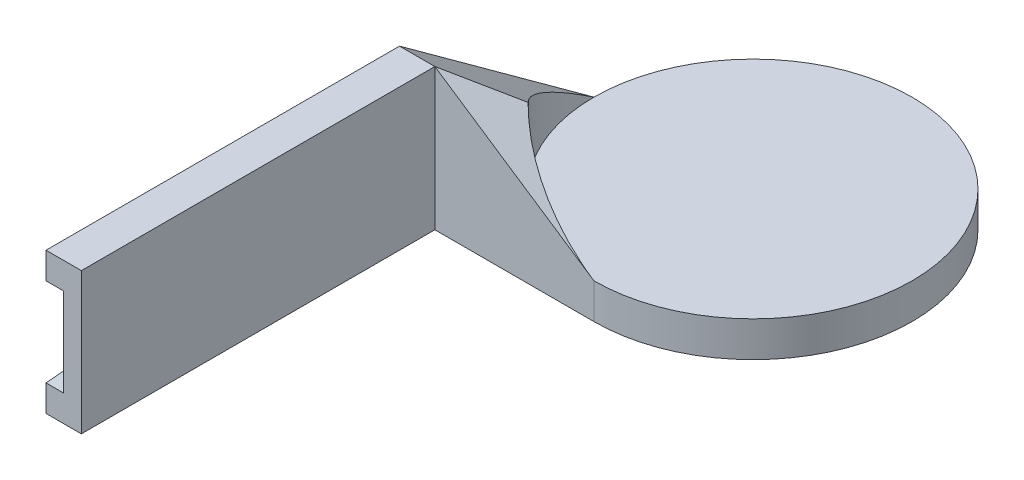
ISO-10303-21;
HEADER;
FILE_DESCRIPTION(('STEP AP214'),'2;1');
FILE_NAME('part.step','',(''),(''),'','','');
FILE_SCHEMA(('AUTOMOTIVE_DESIGN { 1 0 10303 214 1 1 1 1 }'));
ENDSEC;
DATA;
#1=APPLICATION_CONTEXT('core data for automotive mechanical design processes');
#2=APPLICATION_PROTOCOL_DEFINITION('international standard','automotive_design',2000,#1);
#3=PRODUCT_CONTEXT('',#1,'mechanical');
#4=PRODUCT('Part','Part','',(#3));
#5=PRODUCT_RELATED_PRODUCT_CATEGORY('part','',(#4));
#6=PRODUCT_DEFINITION_FORMATION('','',#4);
#7=PRODUCT_DEFINITION_CONTEXT('part definition',#1,'design');
#8=PRODUCT_DEFINITION('design','',#6,#7);
#9=PRODUCT_DEFINITION_SHAPE('','',#8);
#10=(LENGTH_UNIT() NAMED_UNIT(*) SI_UNIT(.MILLI.,.METRE.));
#11=(NAMED_UNIT(*) PLANE_ANGLE_UNIT() SI_UNIT($,.RADIAN.));
#12=(NAMED_UNIT(*) SI_UNIT($,.STERADIAN.) SOLID_ANGLE_UNIT());
#13=UNCERTAINTY_MEASURE_WITH_UNIT(LENGTH_MEASURE(1.E-05),#10,'distance_accuracy_value','');
#14=(GEOMETRIC_REPRESENTATION_CONTEXT(3) GLOBAL_UNCERTAINTY_ASSIGNED_CONTEXT((#13)) GLOBAL_UNIT_ASSIGNED_CONTEXT((#10,
#11,#12)) REPRESENTATION_CONTEXT('',''));
#15=CARTESIAN_POINT('',(0.,0.,0.));
#16=DIRECTION('',(0.,0.,1.));
#17=DIRECTION('',(1.,0.,0.));
#18=AXIS2_PLACEMENT_3D('',#15,#16,#17);
#19=CARTESIAN_POINT('',(22.,8.,29.));
#20=DIRECTION('',(0.,0.,-1.));
#21=DIRECTION('',(1.,0.,0.));
#22=AXIS2_PLACEMENT_3D('',#19,#20,#21);
#23=PLANE('',#22);
#24=DIRECTION('',(-1.,0.,0.));
#25=VECTOR('',#24,1.);
#26=CARTESIAN_POINT('',(12.,1.5,29.));
#27=LINE('',#26,#25);
#28=CARTESIAN_POINT('',(12.,1.5,29.));
#29=VERTEX_POINT('',#28);
#30=CARTESIAN_POINT('',(11.,1.5,29.));
#31=VERTEX_POINT('',#30);
#32=EDGE_CURVE('E232',#29,#31,#27,.T.);
#33=ORIENTED_EDGE('',*,*,#32,.T.);
#34=DIRECTION('',(0.,-1.,0.));
#35=VECTOR('',#34,1.);
#36=CARTESIAN_POINT('',(11.,8.,29.));
#37=LINE('',#36,#35);
#38=CARTESIAN_POINT('',(11.,0.,29.));
#39=VERTEX_POINT('',#38);
#40=EDGE_CURVE('E442',#31,#39,#37,.T.);
#41=ORIENTED_EDGE('',*,*,#40,.T.);
#42=DIRECTION('',(-1.,0.,0.));
#43=VECTOR('',#42,1.);
#44=CARTESIAN_POINT('',(22.,0.,29.));
#45=LINE('',#44,#43);
#46=CARTESIAN_POINT('',(13.,0.,29.));
#47=VERTEX_POINT('',#46);
#48=EDGE_CURVE('E430',#47,#39,#45,.T.);
#49=ORIENTED_EDGE('',*,*,#48,.F.);
#50=DIRECTION('',(0.,-1.,0.));
#51=VECTOR('',#50,1.);
#52=CARTESIAN_POINT('',(13.,8.,29.));
#53=LINE('',#52,#51);
#54=CARTESIAN_POINT('',(13.,8.,29.));
#55=VERTEX_POINT('',#54);
#56=EDGE_CURVE('E446',#55,#47,#53,.T.);
#57=ORIENTED_EDGE('',*,*,#56,.F.);
#58=DIRECTION('',(-1.,0.,0.));
#59=VECTOR('',#58,1.);
#60=CARTESIAN_POINT('',(22.,8.,29.));
#61=LINE('',#60,#59);
#62=CARTESIAN_POINT('',(11.,8.,29.));
#63=VERTEX_POINT('',#62);
#64=EDGE_CURVE('E418',#55,#63,#61,.T.);
#65=ORIENTED_EDGE('',*,*,#64,.T.);
#66=CARTESIAN_POINT('',(11.,6.5,29.));
#67=VERTEX_POINT('',#66);
#68=EDGE_CURVE('E443',#63,#67,#37,.T.);
#69=ORIENTED_EDGE('',*,*,#68,.T.);
#70=DIRECTION('',(-1.,0.,0.));
#71=VECTOR('',#70,1.);
#72=CARTESIAN_POINT('',(12.,6.5,29.));
#73=LINE('',#72,#71);
#74=CARTESIAN_POINT('',(12.,6.5,29.));
#75=VERTEX_POINT('',#74);
#76=EDGE_CURVE('E263',#75,#67,#73,.T.);
#77=ORIENTED_EDGE('',*,*,#76,.F.);
#78=DIRECTION('',(0.,-1.,0.));
#79=VECTOR('',#78,1.);
#80=CARTESIAN_POINT('',(12.,0.,29.));
#81=LINE('',#80,#79);
#82=EDGE_CURVE('E240',#75,#29,#81,.T.);
#83=ORIENTED_EDGE('',*,*,#82,.T.);
#84=EDGE_LOOP('',(#33,#41,#49,#57,#65,#69,#77,#83));
#85=FACE_BOUND('',#84,.T.);
#86=ADVANCED_FACE('F37',(#85),#23,.F.);
#87=CARTESIAN_POINT('',(11.,8.,0.));
#88=DIRECTION('',(1.,0.,0.));
#89=DIRECTION('',(0.,0.,1.));
#90=AXIS2_PLACEMENT_3D('',#87,#88,#89);
#91=PLANE('',#90);
#92=DIRECTION('',(0.,-0.0866296163648418,0.996240588195683));
#93=VECTOR('',#92,1.);
#94=CARTESIAN_POINT('',(11.,3.99155722326454,0.347091932457785));
#95=LINE('',#94,#93);
#96=CARTESIAN_POINT('',(11.,2.5,17.5));
#97=VERTEX_POINT('',#96);
#98=EDGE_CURVE('E250',#97,#31,#95,.T.);
#99=ORIENTED_EDGE('',*,*,#98,.F.);
#100=CARTESIAN_POINT('',(11.,4.,17.5));
#101=DIRECTION('',(1.,0.,0.));
#102=DIRECTION('',(0.,0.,-1.));
#103=AXIS2_PLACEMENT_3D('',#100,#101,#102);
#104=CIRCLE('',#103,1.5);
#105=CARTESIAN_POINT('',(11.,5.5,17.5));
#106=VERTEX_POINT('',#105);
#107=EDGE_CURVE('E224',#97,#106,#104,.T.);
#108=ORIENTED_EDGE('',*,*,#107,.T.);
#109=DIRECTION('',(0.,-0.0866296163648419,-0.996240588195683));
#110=VECTOR('',#109,1.);
#111=CARTESIAN_POINT('',(11.,3.94840525328331,-0.343339587242026));
#112=LINE('',#111,#110);
#113=EDGE_CURVE('E253',#67,#106,#112,.T.);
#114=ORIENTED_EDGE('',*,*,#113,.F.);
#115=ORIENTED_EDGE('',*,*,#68,.F.);
#116=DIRECTION('',(0.,0.,-1.));
#117=VECTOR('',#116,1.);
#118=CARTESIAN_POINT('',(11.,8.,0.));
#119=LINE('',#118,#117);
#120=CARTESIAN_POINT('',(11.,8.,9.));
#121=VERTEX_POINT('',#120);
#122=EDGE_CURVE('E422',#63,#121,#119,.T.);
#123=ORIENTED_EDGE('',*,*,#122,.T.);
#124=DIRECTION('',(0.,-1.,0.));
#125=VECTOR('',#124,1.);
#126=CARTESIAN_POINT('',(11.,8.,9.));
#127=LINE('',#126,#125);
#128=CARTESIAN_POINT('',(11.,0.,9.));
#129=VERTEX_POINT('',#128);
#130=EDGE_CURVE('E439',#121,#129,#127,.T.);
#131=ORIENTED_EDGE('',*,*,#130,.T.);
#132=DIRECTION('',(0.,0.,-1.));
#133=VECTOR('',#132,1.);
#134=CARTESIAN_POINT('',(11.,0.,0.));
#135=LINE('',#134,#133);
#136=EDGE_CURVE('E433',#39,#129,#135,.T.);
#137=ORIENTED_EDGE('',*,*,#136,.F.);
#138=ORIENTED_EDGE('',*,*,#40,.F.);
#139=EDGE_LOOP('',(#99,#108,#114,#115,#123,#131,#137,#138));
#140=FACE_BOUND('',#139,.T.);
#141=ADVANCED_FACE('F482',(#140),#91,.F.);
#142=CARTESIAN_POINT('',(22.,2.,0.));
#143=DIRECTION('',(0.,-1.,0.));
#144=DIRECTION('',(0.,0.,-1.));
#145=AXIS2_PLACEMENT_3D('',#142,#143,#144);
#146=CYLINDRICAL_SURFACE('',#145,9.);
#147=DIRECTION('',(0.,-1.,0.));
#148=VECTOR('',#147,1.);
#149=CARTESIAN_POINT('',(22.,8.,9.));
#150=LINE('',#149,#148);
#151=CARTESIAN_POINT('',(22.,2.,9.));
#152=VERTEX_POINT('',#151);
#153=CARTESIAN_POINT('',(22.,0.,9.));
#154=VERTEX_POINT('',#153);
#155=EDGE_CURVE('E451',#152,#154,#150,.T.);
#156=ORIENTED_EDGE('',*,*,#155,.T.);
#157=CARTESIAN_POINT('',(22.,0.,0.));
#158=DIRECTION('',(0.,-1.,0.));
#159=DIRECTION('',(0.,0.,1.));
#160=AXIS2_PLACEMENT_3D('',#157,#158,#159);
#161=CIRCLE('',#160,9.);
#162=CARTESIAN_POINT('',(13.,0.,0.));
#163=VERTEX_POINT('',#162);
#164=EDGE_CURVE('E454',#163,#154,#161,.T.);
#165=ORIENTED_EDGE('',*,*,#164,.F.);
#166=DIRECTION('',(0.,-1.,0.));
#167=VECTOR('',#166,1.);
#168=CARTESIAN_POINT('',(13.,8.,0.));
#169=LINE('',#168,#167);
#170=CARTESIAN_POINT('',(13.,2.,0.));
#171=VERTEX_POINT('',#170);
#172=EDGE_CURVE('E425',#171,#163,#169,.T.);
#173=ORIENTED_EDGE('',*,*,#172,.F.);
#174=CARTESIAN_POINT('',(22.,2.,0.));
#175=DIRECTION('',(0.,-1.,0.));
#176=DIRECTION('',(0.,0.,1.));
#177=AXIS2_PLACEMENT_3D('',#174,#175,#176);
#178=CIRCLE('',#177,9.);
#179=EDGE_CURVE('E456',#171,#152,#178,.T.);
#180=ORIENTED_EDGE('',*,*,#179,.T.);
#181=EDGE_LOOP('',(#156,#165,#173,#180));
#182=FACE_BOUND('',#181,.T.);
#183=ADVANCED_FACE('F39',(#182),#146,.T.);
#184=CARTESIAN_POINT('',(22.,2.,0.));
#185=DIRECTION('',(0.,1.,0.));
#186=DIRECTION('',(0.,0.,1.));
#187=AXIS2_PLACEMENT_3D('',#184,#185,#186);
#188=PLANE('',#187);
#189=EDGE_CURVE('E45',#152,#171,#178,.T.);
#190=ORIENTED_EDGE('',*,*,#189,.F.);
#191=ORIENTED_EDGE('',*,*,#179,.F.);
#192=EDGE_LOOP('',(#190,#191));
#193=FACE_BOUND('',#192,.T.);
#194=ADVANCED_FACE('F490',(#193),#188,.T.);
#195=CARTESIAN_POINT('',(22.,0.,0.));
#196=DIRECTION('',(0.,1.,0.));
#197=DIRECTION('',(0.,0.,1.));
#198=AXIS2_PLACEMENT_3D('',#195,#196,#197);
#199=PLANE('',#198);
#200=CARTESIAN_POINT('',(15.5,0.,0.));
#201=DIRECTION('',(0.,-1.,0.));
#202=DIRECTION('',(0.,0.,1.));
#203=AXIS2_PLACEMENT_3D('',#200,#201,#202);
#204=CIRCLE('',#203,1.5);
#205=CARTESIAN_POINT('',(15.5,0.,1.5));
#206=VERTEX_POINT('',#205);
#207=CARTESIAN_POINT('',(15.5,0.,-1.5));
#208=VERTEX_POINT('',#207);
#209=EDGE_CURVE('E279',#206,#208,#204,.T.);
#210=ORIENTED_EDGE('',*,*,#209,.F.);
#211=DIRECTION('',(1.,0.,0.));
#212=VECTOR('',#211,1.);
#213=CARTESIAN_POINT('',(22.,0.,1.5));
#214=LINE('',#213,#212);
#215=CARTESIAN_POINT('',(20.,0.,1.5));
#216=VERTEX_POINT('',#215);
#217=EDGE_CURVE('E370',#206,#216,#214,.T.);
#218=ORIENTED_EDGE('',*,*,#217,.T.);
#219=CARTESIAN_POINT('',(22.,0.,0.));
#220=DIRECTION('',(0.,-1.,0.));
#221=DIRECTION('',(0.,0.,1.));
#222=AXIS2_PLACEMENT_3D('',#219,#220,#221);
#223=CIRCLE('',#222,2.5);
#224=CARTESIAN_POINT('',(20.4999999999998,0.,1.99999999999996));
#225=VERTEX_POINT('',#224);
#226=EDGE_CURVE('E341',#225,#216,#223,.T.);
#227=ORIENTED_EDGE('',*,*,#226,.F.);
#228=DIRECTION('',(0.,0.,-1.));
#229=VECTOR('',#228,1.);
#230=CARTESIAN_POINT('',(20.4999999999997,0.,0.));
#231=LINE('',#230,#229);
#232=CARTESIAN_POINT('',(20.4999999999998,0.,6.50000000000004));
#233=VERTEX_POINT('',#232);
#234=EDGE_CURVE('E367',#233,#225,#231,.T.);
#235=ORIENTED_EDGE('',*,*,#234,.F.);
#236=CARTESIAN_POINT('',(21.9999999999997,0.,6.50000000000004));
#237=DIRECTION('',(0.,-1.,0.));
#238=DIRECTION('',(0.,0.,1.));
#239=AXIS2_PLACEMENT_3D('',#236,#237,#238);
#240=CIRCLE('',#239,1.49999999999987);
#241=CARTESIAN_POINT('',(23.4999999999996,0.,6.50000000000004));
#242=VERTEX_POINT('',#241);
#243=EDGE_CURVE('E364',#242,#233,#240,.T.);
#244=ORIENTED_EDGE('',*,*,#243,.F.);
#245=DIRECTION('',(0.,0.,-1.));
#246=VECTOR('',#245,1.);
#247=CARTESIAN_POINT('',(23.4999999999997,0.,0.));
#248=LINE('',#247,#246);
#249=CARTESIAN_POINT('',(23.4999999999998,0.,2.0000000000001));
#250=VERTEX_POINT('',#249);
#251=EDGE_CURVE('E361',#242,#250,#248,.T.);
#252=ORIENTED_EDGE('',*,*,#251,.T.);
#253=CARTESIAN_POINT('',(23.9999999999998,0.,1.50000000000033));
#254=VERTEX_POINT('',#253);
#255=EDGE_CURVE('E360',#254,#250,#223,.T.);
#256=ORIENTED_EDGE('',*,*,#255,.F.);
#257=DIRECTION('',(-1.,0.,0.));
#258=VECTOR('',#257,1.);
#259=CARTESIAN_POINT('',(22.,0.,1.50000000000033));
#260=LINE('',#259,#258);
#261=CARTESIAN_POINT('',(28.4999999999997,0.,1.5000000000004));
#262=VERTEX_POINT('',#261);
#263=EDGE_CURVE('E357',#262,#254,#260,.T.);
#264=ORIENTED_EDGE('',*,*,#263,.F.);
#265=CARTESIAN_POINT('',(28.4999999999997,0.,3.34296608675987E-13));
#266=DIRECTION('',(0.,-1.,0.));
#267=DIRECTION('',(0.,0.,1.));
#268=AXIS2_PLACEMENT_3D('',#265,#266,#267);
#269=CIRCLE('',#268,1.50000000000013);
#270=CARTESIAN_POINT('',(28.4999999999997,0.,-1.49999999999973));
#271=VERTEX_POINT('',#270);
#272=EDGE_CURVE('E354',#271,#262,#269,.T.);
#273=ORIENTED_EDGE('',*,*,#272,.F.);
#274=DIRECTION('',(-1.,0.,0.));
#275=VECTOR('',#274,1.);
#276=CARTESIAN_POINT('',(22.,0.,-1.49999999999967));
#277=LINE('',#276,#275);
#278=CARTESIAN_POINT('',(23.9999999999999,0.,-1.49999999999979));
#279=VERTEX_POINT('',#278);
#280=EDGE_CURVE('E351',#271,#279,#277,.T.);
#281=ORIENTED_EDGE('',*,*,#280,.T.);
#282=CARTESIAN_POINT('',(23.5000000000001,0.,-1.99999999999979));
#283=VERTEX_POINT('',#282);
#284=EDGE_CURVE('E342',#283,#279,#223,.T.);
#285=ORIENTED_EDGE('',*,*,#284,.F.);
#286=DIRECTION('',(0.,0.,1.));
#287=VECTOR('',#286,1.);
#288=CARTESIAN_POINT('',(23.5,0.,0.));
#289=LINE('',#288,#287);
#290=CARTESIAN_POINT('',(23.5000000000002,0.,-6.49999999999971));
#291=VERTEX_POINT('',#290);
#292=EDGE_CURVE('E348',#291,#283,#289,.T.);
#293=ORIENTED_EDGE('',*,*,#292,.F.);
#294=CARTESIAN_POINT('',(22.,0.,-6.49999999999971));
#295=DIRECTION('',(0.,-1.,0.));
#296=DIRECTION('',(0.,0.,1.));
#297=AXIS2_PLACEMENT_3D('',#294,#295,#296);
#298=CIRCLE('',#297,1.50000000000025);
#299=CARTESIAN_POINT('',(20.4999999999999,0.,-6.49999999999971));
#300=VERTEX_POINT('',#299);
#301=EDGE_CURVE('E345',#300,#291,#298,.T.);
#302=ORIENTED_EDGE('',*,*,#301,.F.);
#303=DIRECTION('',(0.,0.,1.));
#304=VECTOR('',#303,1.);
#305=CARTESIAN_POINT('',(20.5,0.,0.));
#306=LINE('',#305,#304);
#307=CARTESIAN_POINT('',(20.5,0.,-1.99999999999981));
#308=VERTEX_POINT('',#307);
#309=EDGE_CURVE('E340',#300,#308,#306,.T.);
#310=ORIENTED_EDGE('',*,*,#309,.T.);
#311=CARTESIAN_POINT('',(20.,0.,-1.5));
#312=VERTEX_POINT('',#311);
#313=EDGE_CURVE('E337',#312,#308,#223,.T.);
#314=ORIENTED_EDGE('',*,*,#313,.F.);
#315=DIRECTION('',(1.,0.,0.));
#316=VECTOR('',#315,1.);
#317=CARTESIAN_POINT('',(22.,0.,-1.5));
#318=LINE('',#317,#316);
#319=EDGE_CURVE('E334',#208,#312,#318,.T.);
#320=ORIENTED_EDGE('',*,*,#319,.F.);
#321=EDGE_LOOP('',(#210,#218,#227,#235,#244,#252,#256,#264,#273,#281,#285,#293,#302,#310,#314,#320));
#322=FACE_BOUND('',#321,.T.);
#323=ORIENTED_EDGE('',*,*,#164,.T.);
#324=DIRECTION('',(-1.,0.,0.));
#325=VECTOR('',#324,1.);
#326=CARTESIAN_POINT('',(22.,0.,9.));
#327=LINE('',#326,#325);
#328=CARTESIAN_POINT('',(13.,0.,9.));
#329=VERTEX_POINT('',#328);
#330=EDGE_CURVE('E415',#154,#329,#327,.T.);
#331=ORIENTED_EDGE('',*,*,#330,.T.);
#332=DIRECTION('',(0.,0.,1.));
#333=VECTOR('',#332,1.);
#334=CARTESIAN_POINT('',(13.,0.,0.));
#335=LINE('',#334,#333);
#336=EDGE_CURVE('E428',#329,#47,#335,.T.);
#337=ORIENTED_EDGE('',*,*,#336,.T.);
#338=ORIENTED_EDGE('',*,*,#48,.T.);
#339=ORIENTED_EDGE('',*,*,#136,.T.);
#340=DIRECTION('',(-0.216930457818656,0.,0.976187060183953));
#341=VECTOR('',#340,1.);
#342=CARTESIAN_POINT('',(13.4235294117647,0.,-1.90588235294118));
#343=LINE('',#342,#341);
#344=EDGE_CURVE('E419',#163,#129,#343,.T.);
#345=ORIENTED_EDGE('',*,*,#344,.F.);
#346=EDGE_LOOP('',(#323,#331,#337,#338,#339,#345));
#347=FACE_BOUND('',#346,.T.);
#348=ADVANCED_FACE('F471',(#322,#347),#199,.F.);
#349=CARTESIAN_POINT('',(22.,8.,0.));
#350=DIRECTION('',(0.,-1.,0.));
#351=DIRECTION('',(0.,0.,-1.));
#352=AXIS2_PLACEMENT_3D('',#349,#350,#351);
#353=CYLINDRICAL_SURFACE('',#352,9.);
#354=CARTESIAN_POINT('',(22.,2.,0.));
#355=DIRECTION('',(0.,0.832050294337844,-0.554700196225229));
#356=DIRECTION('',(0.,-0.554700196225229,-0.832050294337844));
#357=AXIS2_PLACEMENT_3D('',#354,#355,#356);
#358=ELLIPSE('',#357,10.816653826392,9.);
#359=CARTESIAN_POINT('',(15.6360389693211,6.24264068711928,6.36396103067892));
#360=VERTEX_POINT('',#359);
#361=EDGE_CURVE('E268',#171,#360,#358,.T.);
#362=ORIENTED_EDGE('',*,*,#361,.T.);
#363=CARTESIAN_POINT('',(22.,2.,0.));
#364=DIRECTION('',(0.554700196225229,0.832050294337844,0.));
#365=DIRECTION('',(0.832050294337844,-0.554700196225229,0.));
#366=AXIS2_PLACEMENT_3D('',#363,#364,#365);
#367=ELLIPSE('',#366,10.816653826392,9.);
#368=EDGE_CURVE('E276',#360,#152,#367,.T.);
#369=ORIENTED_EDGE('',*,*,#368,.T.);
#370=ORIENTED_EDGE('',*,*,#189,.T.);
#371=EDGE_LOOP('',(#362,#369,#370));
#372=FACE_BOUND('',#371,.T.);
#373=ADVANCED_FACE('F489',(#372),#353,.F.);
#374=CARTESIAN_POINT('',(22.,8.,9.));
#375=DIRECTION('',(0.,0.,-1.));
#376=DIRECTION('',(1.,0.,0.));
#377=AXIS2_PLACEMENT_3D('',#374,#375,#376);
#378=PLANE('',#377);
#379=DIRECTION('',(0.,-1.,0.));
#380=VECTOR('',#379,1.);
#381=CARTESIAN_POINT('',(13.,8.,9.));
#382=LINE('',#381,#380);
#383=CARTESIAN_POINT('',(13.,8.,9.));
#384=VERTEX_POINT('',#383);
#385=EDGE_CURVE('E449',#384,#329,#382,.T.);
#386=ORIENTED_EDGE('',*,*,#385,.T.);
#387=ORIENTED_EDGE('',*,*,#330,.F.);
#388=ORIENTED_EDGE('',*,*,#155,.F.);
#389=DIRECTION('',(-0.832050294337844,0.554700196225229,0.));
#390=VECTOR('',#389,1.);
#391=CARTESIAN_POINT('',(22.,2.,9.));
#392=LINE('',#391,#390);
#393=EDGE_CURVE('E273',#152,#384,#392,.T.);
#394=ORIENTED_EDGE('',*,*,#393,.T.);
#395=EDGE_LOOP('',(#386,#387,#388,#394));
#396=FACE_BOUND('',#395,.T.);
#397=ADVANCED_FACE('F468',(#396),#378,.F.);
#398=CARTESIAN_POINT('',(13.,8.,0.));
#399=DIRECTION('',(-1.,0.,0.));
#400=DIRECTION('',(0.,0.,-1.));
#401=AXIS2_PLACEMENT_3D('',#398,#399,#400);
#402=PLANE('',#401);
#403=ORIENTED_EDGE('',*,*,#336,.F.);
#404=ORIENTED_EDGE('',*,*,#385,.F.);
#405=DIRECTION('',(0.,0.,1.));
#406=VECTOR('',#405,1.);
#407=CARTESIAN_POINT('',(13.,8.,0.));
#408=LINE('',#407,#406);
#409=EDGE_CURVE('E416',#384,#55,#408,.T.);
#410=ORIENTED_EDGE('',*,*,#409,.T.);
#411=ORIENTED_EDGE('',*,*,#56,.T.);
#412=EDGE_LOOP('',(#403,#404,#410,#411));
#413=FACE_BOUND('',#412,.T.);
#414=ADVANCED_FACE('F476',(#413),#402,.F.);
#415=CARTESIAN_POINT('',(13.4235294117647,8.,-1.90588235294118));
#416=DIRECTION('',(-0.976187060183953,0.,-0.216930457818656));
#417=DIRECTION('',(0.216930457818656,0.,-0.976187060183953));
#418=AXIS2_PLACEMENT_3D('',#415,#416,#417);
#419=PLANE('',#418);
#420=DIRECTION('',(0.181818181818182,-0.545454545454546,-0.818181818181818));
#421=VECTOR('',#420,1.);
#422=CARTESIAN_POINT('',(12.702479338843,2.89256198347108,1.33884297520661));
#423=LINE('',#422,#421);
#424=EDGE_CURVE('E271',#121,#171,#423,.T.);
#425=ORIENTED_EDGE('',*,*,#424,.T.);
#426=ORIENTED_EDGE('',*,*,#172,.T.);
#427=ORIENTED_EDGE('',*,*,#344,.T.);
#428=ORIENTED_EDGE('',*,*,#130,.F.);
#429=EDGE_LOOP('',(#425,#426,#427,#428));
#430=FACE_BOUND('',#429,.T.);
#431=ADVANCED_FACE('F485',(#430),#419,.T.);
#432=CARTESIAN_POINT('',(22.,8.,0.));
#433=DIRECTION('',(0.,1.,0.));
#434=DIRECTION('',(0.,0.,1.));
#435=AXIS2_PLACEMENT_3D('',#432,#433,#434);
#436=PLANE('',#435);
#437=DIRECTION('',(-1.,0.,0.));
#438=VECTOR('',#437,1.);
#439=CARTESIAN_POINT('',(20.9859856186797,8.,9.));
#440=LINE('',#439,#438);
#441=EDGE_CURVE('E262',#384,#121,#440,.T.);
#442=ORIENTED_EDGE('',*,*,#441,.T.);
#443=ORIENTED_EDGE('',*,*,#122,.F.);
#444=ORIENTED_EDGE('',*,*,#64,.F.);
#445=ORIENTED_EDGE('',*,*,#409,.F.);
#446=EDGE_LOOP('',(#442,#443,#444,#445));
#447=FACE_BOUND('',#446,.T.);
#448=ADVANCED_FACE('F534',(#447),#436,.T.);
#449=CARTESIAN_POINT('',(15.5,1.,0.));
#450=DIRECTION('',(0.,-1.,0.));
#451=DIRECTION('',(0.,0.,-1.));
#452=AXIS2_PLACEMENT_3D('',#449,#450,#451);
#453=CYLINDRICAL_SURFACE('',#452,1.5);
#454=ORIENTED_EDGE('',*,*,#209,.T.);
#455=DIRECTION('',(0.,-1.,0.));
#456=VECTOR('',#455,1.);
#457=CARTESIAN_POINT('',(15.5,1.,-1.5));
#458=LINE('',#457,#456);
#459=CARTESIAN_POINT('',(15.5,1.,-1.5));
#460=VERTEX_POINT('',#459);
#461=EDGE_CURVE('E413',#460,#208,#458,.T.);
#462=ORIENTED_EDGE('',*,*,#461,.F.);
#463=CARTESIAN_POINT('',(15.5,1.,0.));
#464=DIRECTION('',(0.,-1.,0.));
#465=DIRECTION('',(0.,0.,1.));
#466=AXIS2_PLACEMENT_3D('',#463,#464,#465);
#467=CIRCLE('',#466,1.5);
#468=CARTESIAN_POINT('',(15.5,1.,1.5));
#469=VERTEX_POINT('',#468);
#470=EDGE_CURVE('E280',#469,#460,#467,.T.);
#471=ORIENTED_EDGE('',*,*,#470,.F.);
#472=DIRECTION('',(0.,-1.,0.));
#473=VECTOR('',#472,1.);
#474=CARTESIAN_POINT('',(15.5,1.,1.5));
#475=LINE('',#474,#473);
#476=EDGE_CURVE('E331',#469,#206,#475,.T.);
#477=ORIENTED_EDGE('',*,*,#476,.T.);
#478=EDGE_LOOP('',(#454,#462,#471,#477));
#479=FACE_BOUND('',#478,.T.);
#480=ADVANCED_FACE('F540',(#479),#453,.F.);
#481=CARTESIAN_POINT('',(22.,1.,-1.5));
#482=DIRECTION('',(0.,0.,1.));
#483=DIRECTION('',(-1.,0.,0.));
#484=AXIS2_PLACEMENT_3D('',#481,#482,#483);
#485=PLANE('',#484);
#486=ORIENTED_EDGE('',*,*,#319,.T.);
#487=DIRECTION('',(0.,-1.,0.));
#488=VECTOR('',#487,1.);
#489=CARTESIAN_POINT('',(20.,1.,-1.5));
#490=LINE('',#489,#488);
#491=CARTESIAN_POINT('',(20.,1.,-1.5));
#492=VERTEX_POINT('',#491);
#493=EDGE_CURVE('E411',#492,#312,#490,.T.);
#494=ORIENTED_EDGE('',*,*,#493,.F.);
#495=DIRECTION('',(1.,0.,0.));
#496=VECTOR('',#495,1.);
#497=CARTESIAN_POINT('',(22.,1.,-1.5));
#498=LINE('',#497,#496);
#499=EDGE_CURVE('E283',#460,#492,#498,.T.);
#500=ORIENTED_EDGE('',*,*,#499,.F.);
#501=ORIENTED_EDGE('',*,*,#461,.T.);
#502=EDGE_LOOP('',(#486,#494,#500,#501));
#503=FACE_BOUND('',#502,.T.);
#504=ADVANCED_FACE('F548',(#503),#485,.T.);
#505=CARTESIAN_POINT('',(22.,1.,0.));
#506=DIRECTION('',(0.,-1.,0.));
#507=DIRECTION('',(0.,0.,-1.));
#508=AXIS2_PLACEMENT_3D('',#505,#506,#507);
#509=CYLINDRICAL_SURFACE('',#508,2.5);
#510=ORIENTED_EDGE('',*,*,#313,.T.);
#511=DIRECTION('',(0.,-1.,0.));
#512=VECTOR('',#511,1.);
#513=CARTESIAN_POINT('',(20.5,1.,-1.99999999999981));
#514=LINE('',#513,#512);
#515=CARTESIAN_POINT('',(20.5,1.,-1.99999999999981));
#516=VERTEX_POINT('',#515);
#517=EDGE_CURVE('E409',#516,#308,#514,.T.);
#518=ORIENTED_EDGE('',*,*,#517,.F.);
#519=CARTESIAN_POINT('',(22.,1.,0.));
#520=DIRECTION('',(0.,-1.,0.));
#521=DIRECTION('',(0.,0.,1.));
#522=AXIS2_PLACEMENT_3D('',#519,#520,#521);
#523=CIRCLE('',#522,2.5);
#524=EDGE_CURVE('E287',#492,#516,#523,.T.);
#525=ORIENTED_EDGE('',*,*,#524,.F.);
#526=ORIENTED_EDGE('',*,*,#493,.T.);
#527=EDGE_LOOP('',(#510,#518,#525,#526));
#528=FACE_BOUND('',#527,.T.);
#529=ADVANCED_FACE('F556',(#528),#509,.F.);
#530=CARTESIAN_POINT('',(20.5,1.,0.));
#531=DIRECTION('',(-1.,0.,0.));
#532=DIRECTION('',(0.,0.,-1.));
#533=AXIS2_PLACEMENT_3D('',#530,#531,#532);
#534=PLANE('',#533);
#535=ORIENTED_EDGE('',*,*,#309,.F.);
#536=DIRECTION('',(0.,-1.,0.));
#537=VECTOR('',#536,1.);
#538=CARTESIAN_POINT('',(20.4999999999999,1.,-6.49999999999971));
#539=LINE('',#538,#537);
#540=CARTESIAN_POINT('',(20.4999999999999,1.,-6.49999999999971));
#541=VERTEX_POINT('',#540);
#542=EDGE_CURVE('E407',#541,#300,#539,.T.);
#543=ORIENTED_EDGE('',*,*,#542,.F.);
#544=DIRECTION('',(0.,0.,1.));
#545=VECTOR('',#544,1.);
#546=CARTESIAN_POINT('',(20.5,1.,0.));
#547=LINE('',#546,#545);
#548=EDGE_CURVE('E290',#541,#516,#547,.T.);
#549=ORIENTED_EDGE('',*,*,#548,.T.);
#550=ORIENTED_EDGE('',*,*,#517,.T.);
#551=EDGE_LOOP('',(#535,#543,#549,#550));
#552=FACE_BOUND('',#551,.T.);
#553=ADVANCED_FACE('F564',(#552),#534,.F.);
#554=CARTESIAN_POINT('',(22.,1.,-6.49999999999971));
#555=DIRECTION('',(0.,-1.,0.));
#556=DIRECTION('',(0.,0.,-1.));
#557=AXIS2_PLACEMENT_3D('',#554,#555,#556);
#558=CYLINDRICAL_SURFACE('',#557,1.50000000000025);
#559=ORIENTED_EDGE('',*,*,#301,.T.);
#560=DIRECTION('',(0.,-1.,0.));
#561=VECTOR('',#560,1.);
#562=CARTESIAN_POINT('',(23.5000000000002,1.,-6.49999999999971));
#563=LINE('',#562,#561);
#564=CARTESIAN_POINT('',(23.5000000000002,1.,-6.49999999999971));
#565=VERTEX_POINT('',#564);
#566=EDGE_CURVE('E405',#565,#291,#563,.T.);
#567=ORIENTED_EDGE('',*,*,#566,.F.);
#568=CARTESIAN_POINT('',(22.,1.,-6.49999999999971));
#569=DIRECTION('',(0.,-1.,0.));
#570=DIRECTION('',(0.,0.,1.));
#571=AXIS2_PLACEMENT_3D('',#568,#569,#570);
#572=CIRCLE('',#571,1.50000000000025);
#573=EDGE_CURVE('E294',#541,#565,#572,.T.);
#574=ORIENTED_EDGE('',*,*,#573,.F.);
#575=ORIENTED_EDGE('',*,*,#542,.T.);
#576=EDGE_LOOP('',(#559,#567,#574,#575));
#577=FACE_BOUND('',#576,.T.);
#578=ADVANCED_FACE('F574',(#577),#558,.F.);
#579=CARTESIAN_POINT('',(23.5,1.,0.));
#580=DIRECTION('',(-1.,0.,0.));
#581=DIRECTION('',(0.,0.,-1.));
#582=AXIS2_PLACEMENT_3D('',#579,#580,#581);
#583=PLANE('',#582);
#584=ORIENTED_EDGE('',*,*,#292,.T.);
#585=DIRECTION('',(0.,-1.,0.));
#586=VECTOR('',#585,1.);
#587=CARTESIAN_POINT('',(23.5000000000001,1.,-1.99999999999979));
#588=LINE('',#587,#586);
#589=CARTESIAN_POINT('',(23.5000000000001,1.,-1.99999999999979));
#590=VERTEX_POINT('',#589);
#591=EDGE_CURVE('E403',#590,#283,#588,.T.);
#592=ORIENTED_EDGE('',*,*,#591,.F.);
#593=DIRECTION('',(0.,0.,1.));
#594=VECTOR('',#593,1.);
#595=CARTESIAN_POINT('',(23.5,1.,0.));
#596=LINE('',#595,#594);
#597=EDGE_CURVE('E297',#565,#590,#596,.T.);
#598=ORIENTED_EDGE('',*,*,#597,.F.);
#599=ORIENTED_EDGE('',*,*,#566,.T.);
#600=EDGE_LOOP('',(#584,#592,#598,#599));
#601=FACE_BOUND('',#600,.T.);
#602=ADVANCED_FACE('F582',(#601),#583,.T.);
#603=ORIENTED_EDGE('',*,*,#284,.T.);
#604=DIRECTION('',(0.,-1.,0.));
#605=VECTOR('',#604,1.);
#606=CARTESIAN_POINT('',(23.9999999999999,1.,-1.49999999999979));
#607=LINE('',#606,#605);
#608=CARTESIAN_POINT('',(23.9999999999999,1.,-1.49999999999979));
#609=VERTEX_POINT('',#608);
#610=EDGE_CURVE('E401',#609,#279,#607,.T.);
#611=ORIENTED_EDGE('',*,*,#610,.F.);
#612=EDGE_CURVE('E292',#590,#609,#523,.T.);
#613=ORIENTED_EDGE('',*,*,#612,.F.);
#614=ORIENTED_EDGE('',*,*,#591,.T.);
#615=EDGE_LOOP('',(#603,#611,#613,#614));
#616=FACE_BOUND('',#615,.T.);
#617=ADVANCED_FACE('F567',(#616),#509,.F.);
#618=CARTESIAN_POINT('',(22.,1.,-1.49999999999967));
#619=DIRECTION('',(0.,0.,-1.));
#620=DIRECTION('',(1.,0.,0.));
#621=AXIS2_PLACEMENT_3D('',#618,#619,#620);
#622=PLANE('',#621);
#623=ORIENTED_EDGE('',*,*,#280,.F.);
#624=DIRECTION('',(0.,-1.,0.));
#625=VECTOR('',#624,1.);
#626=CARTESIAN_POINT('',(28.4999999999997,1.,-1.49999999999973));
#627=LINE('',#626,#625);
#628=CARTESIAN_POINT('',(28.4999999999997,1.,-1.49999999999973));
#629=VERTEX_POINT('',#628);
#630=EDGE_CURVE('E399',#629,#271,#627,.T.);
#631=ORIENTED_EDGE('',*,*,#630,.F.);
#632=DIRECTION('',(-1.,0.,0.));
#633=VECTOR('',#632,1.);
#634=CARTESIAN_POINT('',(22.,1.,-1.49999999999967));
#635=LINE('',#634,#633);
#636=EDGE_CURVE('E300',#629,#609,#635,.T.);
#637=ORIENTED_EDGE('',*,*,#636,.T.);
#638=ORIENTED_EDGE('',*,*,#610,.T.);
#639=EDGE_LOOP('',(#623,#631,#637,#638));
#640=FACE_BOUND('',#639,.T.);
#641=ADVANCED_FACE('F597',(#640),#622,.F.);
#642=CARTESIAN_POINT('',(28.4999999999997,1.,3.34296608675987E-13));
#643=DIRECTION('',(0.,-1.,0.));
#644=DIRECTION('',(0.,0.,-1.));
#645=AXIS2_PLACEMENT_3D('',#642,#643,#644);
#646=CYLINDRICAL_SURFACE('',#645,1.50000000000013);
#647=ORIENTED_EDGE('',*,*,#272,.T.);
#648=DIRECTION('',(0.,-1.,0.));
#649=VECTOR('',#648,1.);
#650=CARTESIAN_POINT('',(28.4999999999997,1.,1.5000000000004));
#651=LINE('',#650,#649);
#652=CARTESIAN_POINT('',(28.4999999999997,1.,1.5000000000004));
#653=VERTEX_POINT('',#652);
#654=EDGE_CURVE('E397',#653,#262,#651,.T.);
#655=ORIENTED_EDGE('',*,*,#654,.F.);
#656=CARTESIAN_POINT('',(28.4999999999997,1.,3.34296608675987E-13));
#657=DIRECTION('',(0.,-1.,0.));
#658=DIRECTION('',(0.,0.,1.));
#659=AXIS2_PLACEMENT_3D('',#656,#657,#658);
#660=CIRCLE('',#659,1.50000000000013);
#661=EDGE_CURVE('E302',#629,#653,#660,.T.);
#662=ORIENTED_EDGE('',*,*,#661,.F.);
#663=ORIENTED_EDGE('',*,*,#630,.T.);
#664=EDGE_LOOP('',(#647,#655,#662,#663));
#665=FACE_BOUND('',#664,.T.);
#666=ADVANCED_FACE('F605',(#665),#646,.F.);
#667=CARTESIAN_POINT('',(22.,1.,1.50000000000033));
#668=DIRECTION('',(0.,0.,-1.));
#669=DIRECTION('',(1.,0.,0.));
#670=AXIS2_PLACEMENT_3D('',#667,#668,#669);
#671=PLANE('',#670);
#672=ORIENTED_EDGE('',*,*,#263,.T.);
#673=DIRECTION('',(0.,-1.,0.));
#674=VECTOR('',#673,1.);
#675=CARTESIAN_POINT('',(23.9999999999998,1.,1.50000000000033));
#676=LINE('',#675,#674);
#677=CARTESIAN_POINT('',(23.9999999999998,1.,1.50000000000033));
#678=VERTEX_POINT('',#677);
#679=EDGE_CURVE('E395',#678,#254,#676,.T.);
#680=ORIENTED_EDGE('',*,*,#679,.F.);
#681=DIRECTION('',(-1.,0.,0.));
#682=VECTOR('',#681,1.);
#683=CARTESIAN_POINT('',(22.,1.,1.50000000000033));
#684=LINE('',#683,#682);
#685=EDGE_CURVE('E305',#653,#678,#684,.T.);
#686=ORIENTED_EDGE('',*,*,#685,.F.);
#687=ORIENTED_EDGE('',*,*,#654,.T.);
#688=EDGE_LOOP('',(#672,#680,#686,#687));
#689=FACE_BOUND('',#688,.T.);
#690=ADVANCED_FACE('F613',(#689),#671,.T.);
#691=ORIENTED_EDGE('',*,*,#255,.T.);
#692=DIRECTION('',(0.,-1.,0.));
#693=VECTOR('',#692,1.);
#694=CARTESIAN_POINT('',(23.4999999999998,1.,2.0000000000001));
#695=LINE('',#694,#693);
#696=CARTESIAN_POINT('',(23.4999999999998,1.,2.0000000000001));
#697=VERTEX_POINT('',#696);
#698=EDGE_CURVE('E393',#697,#250,#695,.T.);
#699=ORIENTED_EDGE('',*,*,#698,.F.);
#700=EDGE_CURVE('E308',#678,#697,#523,.T.);
#701=ORIENTED_EDGE('',*,*,#700,.F.);
#702=ORIENTED_EDGE('',*,*,#679,.T.);
#703=EDGE_LOOP('',(#691,#699,#701,#702));
#704=FACE_BOUND('',#703,.T.);
#705=ADVANCED_FACE('F599',(#704),#509,.F.);
#706=CARTESIAN_POINT('',(23.4999999999997,1.,0.));
#707=DIRECTION('',(1.,0.,0.));
#708=DIRECTION('',(0.,0.,1.));
#709=AXIS2_PLACEMENT_3D('',#706,#707,#708);
#710=PLANE('',#709);
#711=ORIENTED_EDGE('',*,*,#251,.F.);
#712=DIRECTION('',(0.,-1.,0.));
#713=VECTOR('',#712,1.);
#714=CARTESIAN_POINT('',(23.4999999999996,1.,6.50000000000004));
#715=LINE('',#714,#713);
#716=CARTESIAN_POINT('',(23.4999999999996,1.,6.50000000000004));
#717=VERTEX_POINT('',#716);
#718=EDGE_CURVE('E391',#717,#242,#715,.T.);
#719=ORIENTED_EDGE('',*,*,#718,.F.);
#720=DIRECTION('',(0.,0.,-1.));
#721=VECTOR('',#720,1.);
#722=CARTESIAN_POINT('',(23.4999999999997,1.,0.));
#723=LINE('',#722,#721);
#724=EDGE_CURVE('E309',#717,#697,#723,.T.);
#725=ORIENTED_EDGE('',*,*,#724,.T.);
#726=ORIENTED_EDGE('',*,*,#698,.T.);
#727=EDGE_LOOP('',(#711,#719,#725,#726));
#728=FACE_BOUND('',#727,.T.);
#729=ADVANCED_FACE('F628',(#728),#710,.F.);
#730=CARTESIAN_POINT('',(21.9999999999997,1.,6.50000000000004));
#731=DIRECTION('',(0.,-1.,0.));
#732=DIRECTION('',(0.,0.,-1.));
#733=AXIS2_PLACEMENT_3D('',#730,#731,#732);
#734=CYLINDRICAL_SURFACE('',#733,1.49999999999987);
#735=ORIENTED_EDGE('',*,*,#243,.T.);
#736=DIRECTION('',(0.,-1.,0.));
#737=VECTOR('',#736,1.);
#738=CARTESIAN_POINT('',(20.4999999999998,1.,6.50000000000004));
#739=LINE('',#738,#737);
#740=CARTESIAN_POINT('',(20.4999999999998,1.,6.50000000000004));
#741=VERTEX_POINT('',#740);
#742=EDGE_CURVE('E389',#741,#233,#739,.T.);
#743=ORIENTED_EDGE('',*,*,#742,.F.);
#744=CARTESIAN_POINT('',(21.9999999999997,1.,6.50000000000004));
#745=DIRECTION('',(0.,-1.,0.));
#746=DIRECTION('',(0.,0.,1.));
#747=AXIS2_PLACEMENT_3D('',#744,#745,#746);
#748=CIRCLE('',#747,1.49999999999987);
#749=EDGE_CURVE('E311',#717,#741,#748,.T.);
#750=ORIENTED_EDGE('',*,*,#749,.F.);
#751=ORIENTED_EDGE('',*,*,#718,.T.);
#752=EDGE_LOOP('',(#735,#743,#750,#751));
#753=FACE_BOUND('',#752,.T.);
#754=ADVANCED_FACE('F635',(#753),#734,.F.);
#755=CARTESIAN_POINT('',(20.4999999999997,1.,0.));
#756=DIRECTION('',(1.,0.,0.));
#757=DIRECTION('',(0.,0.,1.));
#758=AXIS2_PLACEMENT_3D('',#755,#756,#757);
#759=PLANE('',#758);
#760=ORIENTED_EDGE('',*,*,#234,.T.);
#761=DIRECTION('',(0.,-1.,0.));
#762=VECTOR('',#761,1.);
#763=CARTESIAN_POINT('',(20.4999999999998,1.,1.99999999999996));
#764=LINE('',#763,#762);
#765=CARTESIAN_POINT('',(20.4999999999998,1.,1.99999999999996));
#766=VERTEX_POINT('',#765);
#767=EDGE_CURVE('E387',#766,#225,#764,.T.);
#768=ORIENTED_EDGE('',*,*,#767,.F.);
#769=DIRECTION('',(0.,0.,-1.));
#770=VECTOR('',#769,1.);
#771=CARTESIAN_POINT('',(20.4999999999997,1.,0.));
#772=LINE('',#771,#770);
#773=EDGE_CURVE('E314',#741,#766,#772,.T.);
#774=ORIENTED_EDGE('',*,*,#773,.F.);
#775=ORIENTED_EDGE('',*,*,#742,.T.);
#776=EDGE_LOOP('',(#760,#768,#774,#775));
#777=FACE_BOUND('',#776,.T.);
#778=ADVANCED_FACE('F643',(#777),#759,.T.);
#779=ORIENTED_EDGE('',*,*,#226,.T.);
#780=DIRECTION('',(0.,-1.,0.));
#781=VECTOR('',#780,1.);
#782=CARTESIAN_POINT('',(20.,1.,1.5));
#783=LINE('',#782,#781);
#784=CARTESIAN_POINT('',(20.,1.,1.5));
#785=VERTEX_POINT('',#784);
#786=EDGE_CURVE('E385',#785,#216,#783,.T.);
#787=ORIENTED_EDGE('',*,*,#786,.F.);
#788=EDGE_CURVE('E291',#766,#785,#523,.T.);
#789=ORIENTED_EDGE('',*,*,#788,.F.);
#790=ORIENTED_EDGE('',*,*,#767,.T.);
#791=EDGE_LOOP('',(#779,#787,#789,#790));
#792=FACE_BOUND('',#791,.T.);
#793=ADVANCED_FACE('F568',(#792),#509,.F.);
#794=CARTESIAN_POINT('',(22.,1.,-6.49999999999971));
#795=DIRECTION('',(0.,-1.,0.));
#796=DIRECTION('',(0.,0.,-1.));
#797=AXIS2_PLACEMENT_3D('',#794,#795,#796);
#798=CYLINDRICAL_SURFACE('',#797,0.500000000000247);
#799=CARTESIAN_POINT('',(22.,1.,-6.49999999999971));
#800=DIRECTION('',(0.,-1.,0.));
#801=DIRECTION('',(0.,0.,1.));
#802=AXIS2_PLACEMENT_3D('',#799,#800,#801);
#803=CIRCLE('',#802,0.500000000000247);
#804=CARTESIAN_POINT('',(22.,1.,-5.99999999999946));
#805=VERTEX_POINT('',#804);
#806=EDGE_CURVE('E325',#805,#805,#803,.T.);
#807=ORIENTED_EDGE('',*,*,#806,.T.);
#808=EDGE_LOOP('',(#807));
#809=FACE_BOUND('',#808,.T.);
#810=CARTESIAN_POINT('',(22.,0.,-6.49999999999971));
#811=DIRECTION('',(0.,-1.,0.));
#812=DIRECTION('',(0.,0.,1.));
#813=AXIS2_PLACEMENT_3D('',#810,#811,#812);
#814=CIRCLE('',#813,0.500000000000247);
#815=CARTESIAN_POINT('',(22.,0.,-5.99999999999946));
#816=VERTEX_POINT('',#815);
#817=EDGE_CURVE('E379',#816,#816,#814,.T.);
#818=ORIENTED_EDGE('',*,*,#817,.F.);
#819=EDGE_LOOP('',(#818));
#820=FACE_BOUND('',#819,.T.);
#821=ADVANCED_FACE('F658',(#809,#820),#798,.T.);
#822=CARTESIAN_POINT('',(15.5,1.,0.));
#823=DIRECTION('',(0.,-1.,0.));
#824=DIRECTION('',(0.,0.,-1.));
#825=AXIS2_PLACEMENT_3D('',#822,#823,#824);
#826=CYLINDRICAL_SURFACE('',#825,0.5);
#827=CARTESIAN_POINT('',(15.5,1.,0.));
#828=DIRECTION('',(0.,-1.,0.));
#829=DIRECTION('',(0.,0.,1.));
#830=AXIS2_PLACEMENT_3D('',#827,#828,#829);
#831=CIRCLE('',#830,0.5);
#832=CARTESIAN_POINT('',(15.5,1.,0.5));
#833=VERTEX_POINT('',#832);
#834=EDGE_CURVE('E322',#833,#833,#831,.T.);
#835=ORIENTED_EDGE('',*,*,#834,.T.);
#836=EDGE_LOOP('',(#835));
#837=FACE_BOUND('',#836,.T.);
#838=CARTESIAN_POINT('',(15.5,0.,0.));
#839=DIRECTION('',(0.,-1.,0.));
#840=DIRECTION('',(0.,0.,1.));
#841=AXIS2_PLACEMENT_3D('',#838,#839,#840);
#842=CIRCLE('',#841,0.5);
#843=CARTESIAN_POINT('',(15.5,0.,0.5));
#844=VERTEX_POINT('',#843);
#845=EDGE_CURVE('E376',#844,#844,#842,.T.);
#846=ORIENTED_EDGE('',*,*,#845,.F.);
#847=EDGE_LOOP('',(#846));
#848=FACE_BOUND('',#847,.T.);
#849=ADVANCED_FACE('F665',(#837,#848),#826,.T.);
#850=CARTESIAN_POINT('',(21.9999999999997,1.,6.50000000000004));
#851=DIRECTION('',(0.,-1.,0.));
#852=DIRECTION('',(0.,0.,-1.));
#853=AXIS2_PLACEMENT_3D('',#850,#851,#852);
#854=CYLINDRICAL_SURFACE('',#853,0.499999999999868);
#855=CARTESIAN_POINT('',(21.9999999999997,1.,6.50000000000004));
#856=DIRECTION('',(0.,-1.,0.));
#857=DIRECTION('',(0.,0.,1.));
#858=AXIS2_PLACEMENT_3D('',#855,#856,#857);
#859=CIRCLE('',#858,0.499999999999868);
#860=CARTESIAN_POINT('',(21.9999999999997,1.,6.99999999999991));
#861=VERTEX_POINT('',#860);
#862=EDGE_CURVE('E319',#861,#861,#859,.T.);
#863=ORIENTED_EDGE('',*,*,#862,.T.);
#864=EDGE_LOOP('',(#863));
#865=FACE_BOUND('',#864,.T.);
#866=CARTESIAN_POINT('',(21.9999999999997,0.,6.50000000000004));
#867=DIRECTION('',(0.,-1.,0.));
#868=DIRECTION('',(0.,0.,1.));
#869=AXIS2_PLACEMENT_3D('',#866,#867,#868);
#870=CIRCLE('',#869,0.499999999999868);
#871=CARTESIAN_POINT('',(21.9999999999997,0.,6.99999999999991));
#872=VERTEX_POINT('',#871);
#873=EDGE_CURVE('E373',#872,#872,#870,.T.);
#874=ORIENTED_EDGE('',*,*,#873,.F.);
#875=EDGE_LOOP('',(#874));
#876=FACE_BOUND('',#875,.T.);
#877=ADVANCED_FACE('F673',(#865,#876),#854,.T.);
#878=CARTESIAN_POINT('',(22.,1.,1.5));
#879=DIRECTION('',(0.,0.,1.));
#880=DIRECTION('',(-1.,0.,0.));
#881=AXIS2_PLACEMENT_3D('',#878,#879,#880);
#882=PLANE('',#881);
#883=ORIENTED_EDGE('',*,*,#217,.F.);
#884=ORIENTED_EDGE('',*,*,#476,.F.);
#885=DIRECTION('',(1.,0.,0.));
#886=VECTOR('',#885,1.);
#887=CARTESIAN_POINT('',(22.,1.,1.5));
#888=LINE('',#887,#886);
#889=EDGE_CURVE('E317',#469,#785,#888,.T.);
#890=ORIENTED_EDGE('',*,*,#889,.T.);
#891=ORIENTED_EDGE('',*,*,#786,.T.);
#892=EDGE_LOOP('',(#883,#884,#890,#891));
#893=FACE_BOUND('',#892,.T.);
#894=ADVANCED_FACE('F681',(#893),#882,.F.);
#895=CARTESIAN_POINT('',(28.4999999999997,1.,3.34296608675987E-13));
#896=DIRECTION('',(0.,-1.,0.));
#897=DIRECTION('',(0.,0.,-1.));
#898=AXIS2_PLACEMENT_3D('',#895,#896,#897);
#899=CYLINDRICAL_SURFACE('',#898,0.500000000000128);
#900=CARTESIAN_POINT('',(28.4999999999997,1.,3.34296608675987E-13));
#901=DIRECTION('',(0.,-1.,0.));
#902=DIRECTION('',(0.,0.,1.));
#903=AXIS2_PLACEMENT_3D('',#900,#901,#902);
#904=CIRCLE('',#903,0.500000000000128);
#905=CARTESIAN_POINT('',(28.4999999999997,1.,0.500000000000462));
#906=VERTEX_POINT('',#905);
#907=EDGE_CURVE('E328',#906,#906,#904,.T.);
#908=ORIENTED_EDGE('',*,*,#907,.T.);
#909=EDGE_LOOP('',(#908));
#910=FACE_BOUND('',#909,.T.);
#911=CARTESIAN_POINT('',(28.4999999999997,0.,3.34296608675987E-13));
#912=DIRECTION('',(0.,-1.,0.));
#913=DIRECTION('',(0.,0.,1.));
#914=AXIS2_PLACEMENT_3D('',#911,#912,#913);
#915=CIRCLE('',#914,0.500000000000128);
#916=CARTESIAN_POINT('',(28.4999999999997,0.,0.500000000000462));
#917=VERTEX_POINT('',#916);
#918=EDGE_CURVE('E284',#917,#917,#915,.T.);
#919=ORIENTED_EDGE('',*,*,#918,.F.);
#920=EDGE_LOOP('',(#919));
#921=FACE_BOUND('',#920,.T.);
#922=ADVANCED_FACE('F689',(#910,#921),#899,.T.);
#923=CARTESIAN_POINT('',(22.,1.,0.));
#924=DIRECTION('',(0.,1.,0.));
#925=DIRECTION('',(0.,0.,1.));
#926=AXIS2_PLACEMENT_3D('',#923,#924,#925);
#927=PLANE('',#926);
#928=ORIENTED_EDGE('',*,*,#470,.T.);
#929=ORIENTED_EDGE('',*,*,#499,.T.);
#930=ORIENTED_EDGE('',*,*,#524,.T.);
#931=ORIENTED_EDGE('',*,*,#548,.F.);
#932=ORIENTED_EDGE('',*,*,#573,.T.);
#933=ORIENTED_EDGE('',*,*,#597,.T.);
#934=ORIENTED_EDGE('',*,*,#612,.T.);
#935=ORIENTED_EDGE('',*,*,#636,.F.);
#936=ORIENTED_EDGE('',*,*,#661,.T.);
#937=ORIENTED_EDGE('',*,*,#685,.T.);
#938=ORIENTED_EDGE('',*,*,#700,.T.);
#939=ORIENTED_EDGE('',*,*,#724,.F.);
#940=ORIENTED_EDGE('',*,*,#749,.T.);
#941=ORIENTED_EDGE('',*,*,#773,.T.);
#942=ORIENTED_EDGE('',*,*,#788,.T.);
#943=ORIENTED_EDGE('',*,*,#889,.F.);
#944=EDGE_LOOP('',(#928,#929,#930,#931,#932,#933,#934,#935,#936,#937,#938,#939,#940,#941,#942,#943));
#945=FACE_BOUND('',#944,.T.);
#946=ORIENTED_EDGE('',*,*,#862,.F.);
#947=EDGE_LOOP('',(#946));
#948=FACE_BOUND('',#947,.T.);
#949=ORIENTED_EDGE('',*,*,#834,.F.);
#950=EDGE_LOOP('',(#949));
#951=FACE_BOUND('',#950,.T.);
#952=ORIENTED_EDGE('',*,*,#806,.F.);
#953=EDGE_LOOP('',(#952));
#954=FACE_BOUND('',#953,.T.);
#955=ORIENTED_EDGE('',*,*,#907,.F.);
#956=EDGE_LOOP('',(#955));
#957=FACE_BOUND('',#956,.T.);
#958=ADVANCED_FACE('F697',(#945,#948,#951,#954,#957),#927,.F.);
#959=ORIENTED_EDGE('',*,*,#873,.T.);
#960=EDGE_LOOP('',(#959));
#961=FACE_BOUND('',#960,.T.);
#962=ADVANCED_FACE('F705',(#961),#199,.F.);
#963=ORIENTED_EDGE('',*,*,#845,.T.);
#964=EDGE_LOOP('',(#963));
#965=FACE_BOUND('',#964,.T.);
#966=ADVANCED_FACE('F713',(#965),#199,.F.);
#967=ORIENTED_EDGE('',*,*,#817,.T.);
#968=EDGE_LOOP('',(#967));
#969=FACE_BOUND('',#968,.T.);
#970=ADVANCED_FACE('F498',(#969),#199,.F.);
#971=ORIENTED_EDGE('',*,*,#918,.T.);
#972=EDGE_LOOP('',(#971));
#973=FACE_BOUND('',#972,.T.);
#974=ADVANCED_FACE('F499',(#973),#199,.F.);
#975=CARTESIAN_POINT('',(22.,2.,0.));
#976=DIRECTION('',(-0.554700196225229,-0.832050294337844,0.));
#977=DIRECTION('',(-0.832050294337844,0.554700196225229,0.));
#978=AXIS2_PLACEMENT_3D('',#975,#976,#977);
#979=PLANE('',#978);
#980=ORIENTED_EDGE('',*,*,#393,.F.);
#981=ORIENTED_EDGE('',*,*,#368,.F.);
#982=DIRECTION('',(0.639602149066831,-0.426401432711221,-0.639602149066831));
#983=VECTOR('',#982,1.);
#984=CARTESIAN_POINT('',(22.,2.,0.));
#985=LINE('',#984,#983);
#986=EDGE_CURVE('E11',#384,#360,#985,.T.);
#987=ORIENTED_EDGE('',*,*,#986,.F.);
#988=EDGE_LOOP('',(#980,#981,#987));
#989=FACE_BOUND('',#988,.T.);
#990=ADVANCED_FACE('F732',(#989),#979,.F.);
#991=CARTESIAN_POINT('',(20.9859856186797,8.,9.));
#992=DIRECTION('',(0.,-0.832050294337844,0.554700196225229));
#993=DIRECTION('',(0.,-0.554700196225229,-0.832050294337844));
#994=AXIS2_PLACEMENT_3D('',#991,#992,#993);
#995=PLANE('',#994);
#996=ORIENTED_EDGE('',*,*,#424,.F.);
#997=ORIENTED_EDGE('',*,*,#441,.F.);
#998=ORIENTED_EDGE('',*,*,#986,.T.);
#999=ORIENTED_EDGE('',*,*,#361,.F.);
#1000=EDGE_LOOP('',(#996,#997,#998,#999));
#1001=FACE_BOUND('',#1000,.T.);
#1002=ADVANCED_FACE('F487',(#1001),#995,.F.);
#1003=CARTESIAN_POINT('',(12.,3.99155722326454,0.347091932457785));
#1004=DIRECTION('',(0.,0.996240588195683,0.0866296163648418));
#1005=DIRECTION('',(0.,-0.0866296163648418,0.996240588195683));
#1006=AXIS2_PLACEMENT_3D('',#1003,#1004,#1005);
#1007=PLANE('',#1006);
#1008=ORIENTED_EDGE('',*,*,#98,.T.);
#1009=ORIENTED_EDGE('',*,*,#32,.F.);
#1010=DIRECTION('',(0.,-0.0866296163648418,0.996240588195683));
#1011=VECTOR('',#1010,1.);
#1012=CARTESIAN_POINT('',(12.,3.99155722326454,0.347091932457785));
#1013=LINE('',#1012,#1011);
#1014=CARTESIAN_POINT('',(12.,2.5,17.5));
#1015=VERTEX_POINT('',#1014);
#1016=EDGE_CURVE('E216',#1015,#29,#1013,.T.);
#1017=ORIENTED_EDGE('',*,*,#1016,.F.);
#1018=DIRECTION('',(-1.,0.,0.));
#1019=VECTOR('',#1018,1.);
#1020=CARTESIAN_POINT('',(12.,2.5,17.5));
#1021=LINE('',#1020,#1019);
#1022=EDGE_CURVE('E52',#1015,#97,#1021,.T.);
#1023=ORIENTED_EDGE('',*,*,#1022,.T.);
#1024=EDGE_LOOP('',(#1008,#1009,#1017,#1023));
#1025=FACE_BOUND('',#1024,.T.);
#1026=ADVANCED_FACE('F230',(#1025),#1007,.T.);
#1027=CARTESIAN_POINT('',(12.,3.94840525328331,-0.343339587242026));
#1028=DIRECTION('',(0.,-0.996240588195683,0.0866296163648418));
#1029=DIRECTION('',(0.,-0.0866296163648418,-0.996240588195683));
#1030=AXIS2_PLACEMENT_3D('',#1027,#1028,#1029);
#1031=PLANE('',#1030);
#1032=ORIENTED_EDGE('',*,*,#113,.T.);
#1033=DIRECTION('',(-1.,0.,0.));
#1034=VECTOR('',#1033,1.);
#1035=CARTESIAN_POINT('',(12.,5.5,17.5));
#1036=LINE('',#1035,#1034);
#1037=CARTESIAN_POINT('',(12.,5.5,17.5));
#1038=VERTEX_POINT('',#1037);
#1039=EDGE_CURVE('E226',#1038,#106,#1036,.T.);
#1040=ORIENTED_EDGE('',*,*,#1039,.F.);
#1041=DIRECTION('',(0.,-0.0866296163648419,-0.996240588195683));
#1042=VECTOR('',#1041,1.);
#1043=CARTESIAN_POINT('',(12.,3.94840525328331,-0.343339587242026));
#1044=LINE('',#1043,#1042);
#1045=EDGE_CURVE('E218',#75,#1038,#1044,.T.);
#1046=ORIENTED_EDGE('',*,*,#1045,.F.);
#1047=ORIENTED_EDGE('',*,*,#76,.T.);
#1048=EDGE_LOOP('',(#1032,#1040,#1046,#1047));
#1049=FACE_BOUND('',#1048,.T.);
#1050=ADVANCED_FACE('F752',(#1049),#1031,.T.);
#1051=CARTESIAN_POINT('',(12.,4.,22.5));
#1052=DIRECTION('',(-1.,0.,0.));
#1053=DIRECTION('',(0.,0.,-1.));
#1054=AXIS2_PLACEMENT_3D('',#1051,#1052,#1053);
#1055=CYLINDRICAL_SURFACE('',#1054,0.499999999999999);
#1056=CARTESIAN_POINT('',(12.,4.,22.5));
#1057=DIRECTION('',(1.,0.,0.));
#1058=DIRECTION('',(0.,0.,-1.));
#1059=AXIS2_PLACEMENT_3D('',#1056,#1057,#1058);
#1060=CIRCLE('',#1059,0.499999999999999);
#1061=CARTESIAN_POINT('',(12.,4.,22.));
#1062=VERTEX_POINT('',#1061);
#1063=EDGE_CURVE('E245',#1062,#1062,#1060,.T.);
#1064=ORIENTED_EDGE('',*,*,#1063,.F.);
#1065=EDGE_LOOP('',(#1064));
#1066=FACE_BOUND('',#1065,.T.);
#1067=CARTESIAN_POINT('',(11.,4.,22.5));
#1068=DIRECTION('',(1.,0.,0.));
#1069=DIRECTION('',(0.,0.,-1.));
#1070=AXIS2_PLACEMENT_3D('',#1067,#1068,#1069);
#1071=CIRCLE('',#1070,0.499999999999999);
#1072=CARTESIAN_POINT('',(11.,4.,22.));
#1073=VERTEX_POINT('',#1072);
#1074=EDGE_CURVE('E236',#1073,#1073,#1071,.T.);
#1075=ORIENTED_EDGE('',*,*,#1074,.T.);
#1076=EDGE_LOOP('',(#1075));
#1077=FACE_BOUND('',#1076,.T.);
#1078=ADVANCED_FACE('F759',(#1066,#1077),#1055,.T.);
#1079=CARTESIAN_POINT('',(12.,4.,20.));
#1080=DIRECTION('',(-1.,0.,0.));
#1081=DIRECTION('',(0.,0.,-1.));
#1082=AXIS2_PLACEMENT_3D('',#1079,#1080,#1081);
#1083=CYLINDRICAL_SURFACE('',#1082,0.499999999999999);
#1084=CARTESIAN_POINT('',(12.,4.,20.));
#1085=DIRECTION('',(1.,0.,0.));
#1086=DIRECTION('',(0.,0.,-1.));
#1087=AXIS2_PLACEMENT_3D('',#1084,#1085,#1086);
#1088=CIRCLE('',#1087,0.499999999999999);
#1089=CARTESIAN_POINT('',(12.,4.,19.5));
#1090=VERTEX_POINT('',#1089);
#1091=EDGE_CURVE('E242',#1090,#1090,#1088,.T.);
#1092=ORIENTED_EDGE('',*,*,#1091,.F.);
#1093=EDGE_LOOP('',(#1092));
#1094=FACE_BOUND('',#1093,.T.);
#1095=CARTESIAN_POINT('',(11.,4.,20.));
#1096=DIRECTION('',(1.,0.,0.));
#1097=DIRECTION('',(0.,0.,-1.));
#1098=AXIS2_PLACEMENT_3D('',#1095,#1096,#1097);
#1099=CIRCLE('',#1098,0.499999999999999);
#1100=CARTESIAN_POINT('',(11.,4.,19.5));
#1101=VERTEX_POINT('',#1100);
#1102=EDGE_CURVE('E256',#1101,#1101,#1099,.T.);
#1103=ORIENTED_EDGE('',*,*,#1102,.T.);
#1104=EDGE_LOOP('',(#1103));
#1105=FACE_BOUND('',#1104,.T.);
#1106=ADVANCED_FACE('F767',(#1094,#1105),#1083,.T.);
#1107=CARTESIAN_POINT('',(12.,4.,17.5));
#1108=DIRECTION('',(-1.,0.,0.));
#1109=DIRECTION('',(0.,0.,-1.));
#1110=AXIS2_PLACEMENT_3D('',#1107,#1108,#1109);
#1111=CYLINDRICAL_SURFACE('',#1110,1.5);
#1112=ORIENTED_EDGE('',*,*,#107,.F.);
#1113=ORIENTED_EDGE('',*,*,#1022,.F.);
#1114=CARTESIAN_POINT('',(12.,4.,17.5));
#1115=DIRECTION('',(1.,0.,0.));
#1116=DIRECTION('',(0.,0.,-1.));
#1117=AXIS2_PLACEMENT_3D('',#1114,#1115,#1116);
#1118=CIRCLE('',#1117,1.5);
#1119=EDGE_CURVE('E212',#1015,#1038,#1118,.T.);
#1120=ORIENTED_EDGE('',*,*,#1119,.T.);
#1121=ORIENTED_EDGE('',*,*,#1039,.T.);
#1122=EDGE_LOOP('',(#1112,#1113,#1120,#1121));
#1123=FACE_BOUND('',#1122,.T.);
#1124=ADVANCED_FACE('F222',(#1123),#1111,.F.);
#1125=CARTESIAN_POINT('',(12.,4.,17.5));
#1126=DIRECTION('',(-1.,0.,0.));
#1127=DIRECTION('',(0.,0.,-1.));
#1128=AXIS2_PLACEMENT_3D('',#1125,#1126,#1127);
#1129=CYLINDRICAL_SURFACE('',#1128,0.499999999999999);
#1130=CARTESIAN_POINT('',(12.,4.,17.5));
#1131=DIRECTION('',(1.,0.,0.));
#1132=DIRECTION('',(0.,0.,-1.));
#1133=AXIS2_PLACEMENT_3D('',#1130,#1131,#1132);
#1134=CIRCLE('',#1133,0.499999999999999);
#1135=CARTESIAN_POINT('',(12.,4.,17.));
#1136=VERTEX_POINT('',#1135);
#1137=EDGE_CURVE('E227',#1136,#1136,#1134,.T.);
#1138=ORIENTED_EDGE('',*,*,#1137,.F.);
#1139=EDGE_LOOP('',(#1138));
#1140=FACE_BOUND('',#1139,.T.);
#1141=CARTESIAN_POINT('',(11.,4.,17.5));
#1142=DIRECTION('',(1.,0.,0.));
#1143=DIRECTION('',(0.,0.,-1.));
#1144=AXIS2_PLACEMENT_3D('',#1141,#1142,#1143);
#1145=CIRCLE('',#1144,0.499999999999999);
#1146=CARTESIAN_POINT('',(11.,4.,17.));
#1147=VERTEX_POINT('',#1146);
#1148=EDGE_CURVE('E233',#1147,#1147,#1145,.T.);
#1149=ORIENTED_EDGE('',*,*,#1148,.T.);
#1150=EDGE_LOOP('',(#1149));
#1151=FACE_BOUND('',#1150,.T.);
#1152=ADVANCED_FACE('F782',(#1140,#1151),#1129,.T.);
#1153=CARTESIAN_POINT('',(12.,0.,0.));
#1154=DIRECTION('',(-1.,0.,0.));
#1155=DIRECTION('',(0.,0.,-1.));
#1156=AXIS2_PLACEMENT_3D('',#1153,#1154,#1155);
#1157=PLANE('',#1156);
#1158=ORIENTED_EDGE('',*,*,#1016,.T.);
#1159=ORIENTED_EDGE('',*,*,#82,.F.);
#1160=ORIENTED_EDGE('',*,*,#1045,.T.);
#1161=ORIENTED_EDGE('',*,*,#1119,.F.);
#1162=EDGE_LOOP('',(#1158,#1159,#1160,#1161));
#1163=FACE_BOUND('',#1162,.T.);
#1164=ORIENTED_EDGE('',*,*,#1091,.T.);
#1165=EDGE_LOOP('',(#1164));
#1166=FACE_BOUND('',#1165,.T.);
#1167=ORIENTED_EDGE('',*,*,#1063,.T.);
#1168=EDGE_LOOP('',(#1167));
#1169=FACE_BOUND('',#1168,.T.);
#1170=ORIENTED_EDGE('',*,*,#1137,.T.);
#1171=EDGE_LOOP('',(#1170));
#1172=FACE_BOUND('',#1171,.T.);
#1173=ADVANCED_FACE('F213',(#1163,#1166,#1169,#1172),#1157,.T.);
#1174=ORIENTED_EDGE('',*,*,#1102,.F.);
#1175=EDGE_LOOP('',(#1174));
#1176=FACE_BOUND('',#1175,.T.);
#1177=ADVANCED_FACE('F508',(#1176),#91,.F.);
#1178=ORIENTED_EDGE('',*,*,#1074,.F.);
#1179=EDGE_LOOP('',(#1178));
#1180=FACE_BOUND('',#1179,.T.);
#1181=ADVANCED_FACE('F510',(#1180),#91,.F.);
#1182=ORIENTED_EDGE('',*,*,#1148,.F.);
#1183=EDGE_LOOP('',(#1182));
#1184=FACE_BOUND('',#1183,.T.);
#1185=ADVANCED_FACE('F507',(#1184),#91,.F.);
#1186=CLOSED_SHELL('',(#86,#141,#183,#194,#348,#373,#397,#414,#431,#448,#480,#504,#529,#553,
#578,#602,#617,#641,#666,#690,#705,#729,#754,#778,#793,#821,#849,#877,#894,#922,#958,#962,#966,
#970,#974,#990,#1002,#1026,#1050,#1078,#1106,#1124,#1152,#1173,#1177,#1181,#1185));
#1187=MANIFOLD_SOLID_BREP('B2',#1186);
#1188=ADVANCED_BREP_SHAPE_REPRESENTATION('',(#18,#1187),#14);
#1189=SHAPE_DEFINITION_REPRESENTATION(#9,#1188);
ENDSEC;
END-ISO-10303-21;
